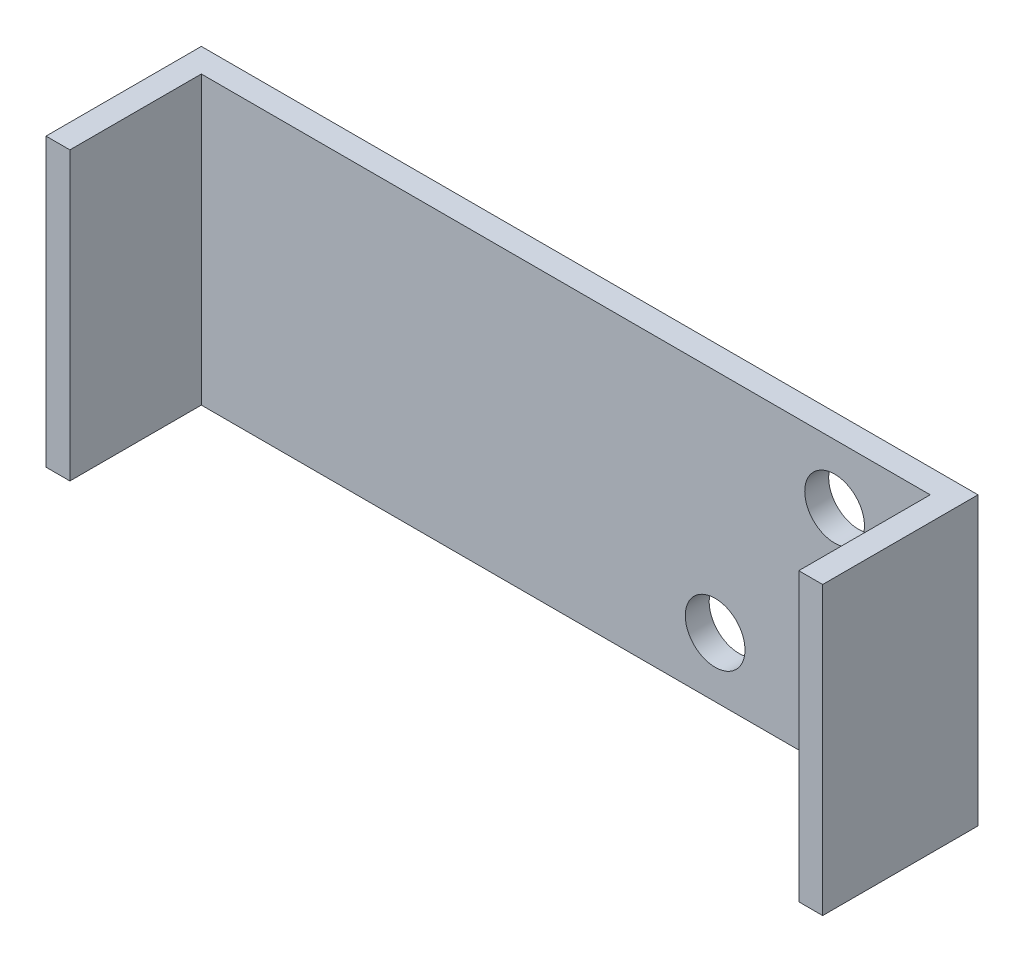
ISO-10303-21;
HEADER;
FILE_DESCRIPTION(('STEP AP214'),'2;1');
FILE_NAME('part.step','',(''),(''),'','','');
FILE_SCHEMA(('AUTOMOTIVE_DESIGN { 1 0 10303 214 1 1 1 1 }'));
ENDSEC;
DATA;
#1=APPLICATION_CONTEXT('core data for automotive mechanical design processes');
#2=APPLICATION_PROTOCOL_DEFINITION('international standard','automotive_design',2000,#1);
#3=PRODUCT_CONTEXT('',#1,'mechanical');
#4=PRODUCT('Part','Part','',(#3));
#5=PRODUCT_RELATED_PRODUCT_CATEGORY('part','',(#4));
#6=PRODUCT_DEFINITION_FORMATION('','',#4);
#7=PRODUCT_DEFINITION_CONTEXT('part definition',#1,'design');
#8=PRODUCT_DEFINITION('design','',#6,#7);
#9=PRODUCT_DEFINITION_SHAPE('','',#8);
#10=(LENGTH_UNIT() NAMED_UNIT(*) SI_UNIT(.MILLI.,.METRE.));
#11=(NAMED_UNIT(*) PLANE_ANGLE_UNIT() SI_UNIT($,.RADIAN.));
#12=(NAMED_UNIT(*) SI_UNIT($,.STERADIAN.) SOLID_ANGLE_UNIT());
#13=UNCERTAINTY_MEASURE_WITH_UNIT(LENGTH_MEASURE(1.E-05),#10,'distance_accuracy_value','');
#14=(GEOMETRIC_REPRESENTATION_CONTEXT(3) GLOBAL_UNCERTAINTY_ASSIGNED_CONTEXT((#13)) GLOBAL_UNIT_ASSIGNED_CONTEXT((#10,
#11,#12)) REPRESENTATION_CONTEXT('',''));
#15=CARTESIAN_POINT('',(0.,0.,0.));
#16=DIRECTION('',(0.,0.,1.));
#17=DIRECTION('',(1.,0.,0.));
#18=AXIS2_PLACEMENT_3D('',#15,#16,#17);
#19=CARTESIAN_POINT('',(0.,0.,13.));
#20=DIRECTION('',(0.,0.,1.));
#21=DIRECTION('',(1.,0.,0.));
#22=AXIS2_PLACEMENT_3D('',#19,#20,#21);
#23=PLANE('',#22);
#24=DIRECTION('',(0.,-1.,0.));
#25=VECTOR('',#24,1.);
#26=CARTESIAN_POINT('',(-63.,24.,13.));
#27=LINE('',#26,#25);
#28=CARTESIAN_POINT('',(-63.,24.,13.));
#29=VERTEX_POINT('',#28);
#30=CARTESIAN_POINT('',(-63.,0.,13.));
#31=VERTEX_POINT('',#30);
#32=EDGE_CURVE('E113',#29,#31,#27,.T.);
#33=ORIENTED_EDGE('',*,*,#32,.F.);
#34=DIRECTION('',(-1.,0.,0.));
#35=VECTOR('',#34,1.);
#36=CARTESIAN_POINT('',(0.,24.,13.));
#37=LINE('',#36,#35);
#38=CARTESIAN_POINT('',(-65.,24.,13.));
#39=VERTEX_POINT('',#38);
#40=EDGE_CURVE('E146',#29,#39,#37,.T.);
#41=ORIENTED_EDGE('',*,*,#40,.T.);
#42=DIRECTION('',(0.,-1.,0.));
#43=VECTOR('',#42,1.);
#44=CARTESIAN_POINT('',(-65.,0.,13.));
#45=LINE('',#44,#43);
#46=CARTESIAN_POINT('',(-65.,0.,13.));
#47=VERTEX_POINT('',#46);
#48=EDGE_CURVE('E148',#39,#47,#45,.T.);
#49=ORIENTED_EDGE('',*,*,#48,.T.);
#50=DIRECTION('',(1.,0.,0.));
#51=VECTOR('',#50,1.);
#52=CARTESIAN_POINT('',(0.,0.,13.));
#53=LINE('',#52,#51);
#54=EDGE_CURVE('E150',#47,#31,#53,.T.);
#55=ORIENTED_EDGE('',*,*,#54,.T.);
#56=EDGE_LOOP('',(#33,#41,#49,#55));
#57=FACE_BOUND('',#56,.T.);
#58=ADVANCED_FACE('F33',(#57),#23,.T.);
#59=CARTESIAN_POINT('',(0.,0.,13.));
#60=DIRECTION('',(-1.,0.,0.));
#61=DIRECTION('',(0.,-1.,0.));
#62=AXIS2_PLACEMENT_3D('',#59,#60,#61);
#63=PLANE('',#62);
#64=DIRECTION('',(0.,1.,0.));
#65=VECTOR('',#64,1.);
#66=CARTESIAN_POINT('',(0.,0.,0.));
#67=LINE('',#66,#65);
#68=CARTESIAN_POINT('',(0.,0.,0.));
#69=VERTEX_POINT('',#68);
#70=CARTESIAN_POINT('',(0.,24.,0.));
#71=VERTEX_POINT('',#70);
#72=EDGE_CURVE('E140',#69,#71,#67,.T.);
#73=ORIENTED_EDGE('',*,*,#72,.T.);
#74=DIRECTION('',(0.,0.,-1.));
#75=VECTOR('',#74,1.);
#76=CARTESIAN_POINT('',(0.,24.,13.));
#77=LINE('',#76,#75);
#78=CARTESIAN_POINT('',(0.,24.,13.));
#79=VERTEX_POINT('',#78);
#80=EDGE_CURVE('E11',#79,#71,#77,.T.);
#81=ORIENTED_EDGE('',*,*,#80,.F.);
#82=DIRECTION('',(0.,1.,0.));
#83=VECTOR('',#82,1.);
#84=CARTESIAN_POINT('',(0.,0.,13.));
#85=LINE('',#84,#83);
#86=CARTESIAN_POINT('',(0.,0.,13.));
#87=VERTEX_POINT('',#86);
#88=EDGE_CURVE('E144',#87,#79,#85,.T.);
#89=ORIENTED_EDGE('',*,*,#88,.F.);
#90=DIRECTION('',(0.,0.,-1.));
#91=VECTOR('',#90,1.);
#92=CARTESIAN_POINT('',(0.,0.,13.));
#93=LINE('',#92,#91);
#94=EDGE_CURVE('E152',#87,#69,#93,.T.);
#95=ORIENTED_EDGE('',*,*,#94,.T.);
#96=EDGE_LOOP('',(#73,#81,#89,#95));
#97=FACE_BOUND('',#96,.T.);
#98=ADVANCED_FACE('F35',(#97),#63,.F.);
#99=CARTESIAN_POINT('',(0.,24.,13.));
#100=DIRECTION('',(0.,-1.,0.));
#101=DIRECTION('',(1.,0.,0.));
#102=AXIS2_PLACEMENT_3D('',#99,#100,#101);
#103=PLANE('',#102);
#104=ORIENTED_EDGE('',*,*,#40,.F.);
#105=DIRECTION('',(0.,0.,1.));
#106=VECTOR('',#105,1.);
#107=CARTESIAN_POINT('',(-63.,24.,2.));
#108=LINE('',#107,#106);
#109=CARTESIAN_POINT('',(-63.,24.,2.));
#110=VERTEX_POINT('',#109);
#111=EDGE_CURVE('E138',#110,#29,#108,.T.);
#112=ORIENTED_EDGE('',*,*,#111,.F.);
#113=DIRECTION('',(-1.,0.,0.));
#114=VECTOR('',#113,1.);
#115=CARTESIAN_POINT('',(-63.,24.,2.));
#116=LINE('',#115,#114);
#117=CARTESIAN_POINT('',(-2.,24.,2.));
#118=VERTEX_POINT('',#117);
#119=EDGE_CURVE('E117',#118,#110,#116,.T.);
#120=ORIENTED_EDGE('',*,*,#119,.F.);
#121=DIRECTION('',(0.,0.,1.));
#122=VECTOR('',#121,1.);
#123=CARTESIAN_POINT('',(-2.,24.,2.));
#124=LINE('',#123,#122);
#125=CARTESIAN_POINT('',(-2.,24.,13.));
#126=VERTEX_POINT('',#125);
#127=EDGE_CURVE('E141',#118,#126,#124,.T.);
#128=ORIENTED_EDGE('',*,*,#127,.T.);
#129=EDGE_CURVE('E85',#79,#126,#37,.T.);
#130=ORIENTED_EDGE('',*,*,#129,.F.);
#131=ORIENTED_EDGE('',*,*,#80,.T.);
#132=DIRECTION('',(-1.,0.,0.));
#133=VECTOR('',#132,1.);
#134=CARTESIAN_POINT('',(0.,24.,0.));
#135=LINE('',#134,#133);
#136=CARTESIAN_POINT('',(-65.,24.,0.));
#137=VERTEX_POINT('',#136);
#138=EDGE_CURVE('E155',#71,#137,#135,.T.);
#139=ORIENTED_EDGE('',*,*,#138,.T.);
#140=DIRECTION('',(0.,0.,-1.));
#141=VECTOR('',#140,1.);
#142=CARTESIAN_POINT('',(-65.,24.,13.));
#143=LINE('',#142,#141);
#144=EDGE_CURVE('E41',#39,#137,#143,.T.);
#145=ORIENTED_EDGE('',*,*,#144,.F.);
#146=EDGE_LOOP('',(#104,#112,#120,#128,#130,#131,#139,#145));
#147=FACE_BOUND('',#146,.T.);
#148=ADVANCED_FACE('F178',(#147),#103,.F.);
#149=CARTESIAN_POINT('',(-65.,0.,13.));
#150=DIRECTION('',(1.,0.,0.));
#151=DIRECTION('',(0.,0.,-1.));
#152=AXIS2_PLACEMENT_3D('',#149,#150,#151);
#153=PLANE('',#152);
#154=DIRECTION('',(0.,-1.,0.));
#155=VECTOR('',#154,1.);
#156=CARTESIAN_POINT('',(-65.,0.,0.));
#157=LINE('',#156,#155);
#158=CARTESIAN_POINT('',(-65.,0.,0.));
#159=VERTEX_POINT('',#158);
#160=EDGE_CURVE('E157',#137,#159,#157,.T.);
#161=ORIENTED_EDGE('',*,*,#160,.T.);
#162=DIRECTION('',(0.,0.,-1.));
#163=VECTOR('',#162,1.);
#164=CARTESIAN_POINT('',(-65.,0.,13.));
#165=LINE('',#164,#163);
#166=EDGE_CURVE('E161',#47,#159,#165,.T.);
#167=ORIENTED_EDGE('',*,*,#166,.F.);
#168=ORIENTED_EDGE('',*,*,#48,.F.);
#169=ORIENTED_EDGE('',*,*,#144,.T.);
#170=EDGE_LOOP('',(#161,#167,#168,#169));
#171=FACE_BOUND('',#170,.T.);
#172=ADVANCED_FACE('F167',(#171),#153,.F.);
#173=CARTESIAN_POINT('',(0.,0.,13.));
#174=DIRECTION('',(0.,1.,0.));
#175=DIRECTION('',(0.,0.,1.));
#176=AXIS2_PLACEMENT_3D('',#173,#174,#175);
#177=PLANE('',#176);
#178=DIRECTION('',(1.,0.,0.));
#179=VECTOR('',#178,1.);
#180=CARTESIAN_POINT('',(-63.,0.,2.));
#181=LINE('',#180,#179);
#182=CARTESIAN_POINT('',(-63.,0.,2.));
#183=VERTEX_POINT('',#182);
#184=CARTESIAN_POINT('',(-2.,0.,2.));
#185=VERTEX_POINT('',#184);
#186=EDGE_CURVE('E123',#183,#185,#181,.T.);
#187=ORIENTED_EDGE('',*,*,#186,.F.);
#188=DIRECTION('',(0.,0.,1.));
#189=VECTOR('',#188,1.);
#190=CARTESIAN_POINT('',(-63.,0.,2.));
#191=LINE('',#190,#189);
#192=EDGE_CURVE('E107',#183,#31,#191,.T.);
#193=ORIENTED_EDGE('',*,*,#192,.T.);
#194=ORIENTED_EDGE('',*,*,#54,.F.);
#195=ORIENTED_EDGE('',*,*,#166,.T.);
#196=DIRECTION('',(1.,0.,0.));
#197=VECTOR('',#196,1.);
#198=CARTESIAN_POINT('',(0.,0.,0.));
#199=LINE('',#198,#197);
#200=EDGE_CURVE('E78',#159,#69,#199,.T.);
#201=ORIENTED_EDGE('',*,*,#200,.T.);
#202=ORIENTED_EDGE('',*,*,#94,.F.);
#203=CARTESIAN_POINT('',(-2.,0.,13.));
#204=VERTEX_POINT('',#203);
#205=EDGE_CURVE('E56',#204,#87,#53,.T.);
#206=ORIENTED_EDGE('',*,*,#205,.F.);
#207=DIRECTION('',(0.,0.,1.));
#208=VECTOR('',#207,1.);
#209=CARTESIAN_POINT('',(-2.,0.,2.));
#210=LINE('',#209,#208);
#211=EDGE_CURVE('E48',#185,#204,#210,.T.);
#212=ORIENTED_EDGE('',*,*,#211,.F.);
#213=EDGE_LOOP('',(#187,#193,#194,#195,#201,#202,#206,#212));
#214=FACE_BOUND('',#213,.T.);
#215=ADVANCED_FACE('F128',(#214),#177,.F.);
#216=DIRECTION('',(0.,1.,0.));
#217=VECTOR('',#216,1.);
#218=CARTESIAN_POINT('',(-2.,24.,13.));
#219=LINE('',#218,#217);
#220=EDGE_CURVE('E126',#204,#126,#219,.T.);
#221=ORIENTED_EDGE('',*,*,#220,.F.);
#222=ORIENTED_EDGE('',*,*,#205,.T.);
#223=ORIENTED_EDGE('',*,*,#88,.T.);
#224=ORIENTED_EDGE('',*,*,#129,.T.);
#225=EDGE_LOOP('',(#221,#222,#223,#224));
#226=FACE_BOUND('',#225,.T.);
#227=ADVANCED_FACE('F176',(#226),#23,.T.);
#228=CARTESIAN_POINT('',(0.,0.,0.));
#229=DIRECTION('',(0.,0.,1.));
#230=DIRECTION('',(1.,0.,0.));
#231=AXIS2_PLACEMENT_3D('',#228,#229,#230);
#232=PLANE('',#231);
#233=CARTESIAN_POINT('',(-10.,19.,0.));
#234=DIRECTION('',(0.,0.,-1.));
#235=DIRECTION('',(-1.,0.,0.));
#236=AXIS2_PLACEMENT_3D('',#233,#234,#235);
#237=CIRCLE('',#236,2.5);
#238=CARTESIAN_POINT('',(-12.5,19.,0.));
#239=VERTEX_POINT('',#238);
#240=EDGE_CURVE('E274',#239,#239,#237,.T.);
#241=ORIENTED_EDGE('',*,*,#240,.F.);
#242=EDGE_LOOP('',(#241));
#243=FACE_BOUND('',#242,.T.);
#244=CARTESIAN_POINT('',(-20.,5.00000000000001,0.));
#245=DIRECTION('',(0.,0.,-1.));
#246=DIRECTION('',(-1.,0.,0.));
#247=AXIS2_PLACEMENT_3D('',#244,#245,#246);
#248=CIRCLE('',#247,2.5);
#249=CARTESIAN_POINT('',(-22.5,5.00000000000001,0.));
#250=VERTEX_POINT('',#249);
#251=EDGE_CURVE('E279',#250,#250,#248,.T.);
#252=ORIENTED_EDGE('',*,*,#251,.F.);
#253=EDGE_LOOP('',(#252));
#254=FACE_BOUND('',#253,.T.);
#255=ORIENTED_EDGE('',*,*,#72,.F.);
#256=ORIENTED_EDGE('',*,*,#200,.F.);
#257=ORIENTED_EDGE('',*,*,#160,.F.);
#258=ORIENTED_EDGE('',*,*,#138,.F.);
#259=EDGE_LOOP('',(#255,#256,#257,#258));
#260=FACE_BOUND('',#259,.T.);
#261=ADVANCED_FACE('F172',(#243,#254,#260),#232,.F.);
#262=CARTESIAN_POINT('',(-63.,24.,2.));
#263=DIRECTION('',(-1.,0.,0.));
#264=DIRECTION('',(0.,0.,1.));
#265=AXIS2_PLACEMENT_3D('',#262,#263,#264);
#266=PLANE('',#265);
#267=ORIENTED_EDGE('',*,*,#32,.T.);
#268=ORIENTED_EDGE('',*,*,#192,.F.);
#269=DIRECTION('',(0.,-1.,0.));
#270=VECTOR('',#269,1.);
#271=CARTESIAN_POINT('',(-63.,24.,2.));
#272=LINE('',#271,#270);
#273=EDGE_CURVE('E110',#110,#183,#272,.T.);
#274=ORIENTED_EDGE('',*,*,#273,.F.);
#275=ORIENTED_EDGE('',*,*,#111,.T.);
#276=EDGE_LOOP('',(#267,#268,#274,#275));
#277=FACE_BOUND('',#276,.T.);
#278=ADVANCED_FACE('F109',(#277),#266,.F.);
#279=CARTESIAN_POINT('',(-2.,24.,2.));
#280=DIRECTION('',(1.,0.,0.));
#281=DIRECTION('',(0.,0.,-1.));
#282=AXIS2_PLACEMENT_3D('',#279,#280,#281);
#283=PLANE('',#282);
#284=ORIENTED_EDGE('',*,*,#220,.T.);
#285=ORIENTED_EDGE('',*,*,#127,.F.);
#286=DIRECTION('',(0.,1.,0.));
#287=VECTOR('',#286,1.);
#288=CARTESIAN_POINT('',(-2.,24.,2.));
#289=LINE('',#288,#287);
#290=EDGE_CURVE('E129',#185,#118,#289,.T.);
#291=ORIENTED_EDGE('',*,*,#290,.F.);
#292=ORIENTED_EDGE('',*,*,#211,.T.);
#293=EDGE_LOOP('',(#284,#285,#291,#292));
#294=FACE_BOUND('',#293,.T.);
#295=ADVANCED_FACE('F177',(#294),#283,.F.);
#296=CARTESIAN_POINT('',(0.,0.,2.));
#297=DIRECTION('',(0.,0.,1.));
#298=DIRECTION('',(1.,0.,0.));
#299=AXIS2_PLACEMENT_3D('',#296,#297,#298);
#300=PLANE('',#299);
#301=CARTESIAN_POINT('',(-10.,19.,2.));
#302=DIRECTION('',(0.,0.,-1.));
#303=DIRECTION('',(-1.,0.,0.));
#304=AXIS2_PLACEMENT_3D('',#301,#302,#303);
#305=CIRCLE('',#304,2.5);
#306=CARTESIAN_POINT('',(-12.5,19.,2.));
#307=VERTEX_POINT('',#306);
#308=EDGE_CURVE('E136',#307,#307,#305,.T.);
#309=ORIENTED_EDGE('',*,*,#308,.T.);
#310=EDGE_LOOP('',(#309));
#311=FACE_BOUND('',#310,.T.);
#312=CARTESIAN_POINT('',(-20.,5.00000000000001,2.));
#313=DIRECTION('',(0.,0.,-1.));
#314=DIRECTION('',(-1.,0.,0.));
#315=AXIS2_PLACEMENT_3D('',#312,#313,#314);
#316=CIRCLE('',#315,2.5);
#317=CARTESIAN_POINT('',(-22.5,5.00000000000001,2.));
#318=VERTEX_POINT('',#317);
#319=EDGE_CURVE('E275',#318,#318,#316,.T.);
#320=ORIENTED_EDGE('',*,*,#319,.T.);
#321=EDGE_LOOP('',(#320));
#322=FACE_BOUND('',#321,.T.);
#323=ORIENTED_EDGE('',*,*,#273,.T.);
#324=ORIENTED_EDGE('',*,*,#186,.T.);
#325=ORIENTED_EDGE('',*,*,#290,.T.);
#326=ORIENTED_EDGE('',*,*,#119,.T.);
#327=EDGE_LOOP('',(#323,#324,#325,#326));
#328=FACE_BOUND('',#327,.T.);
#329=ADVANCED_FACE('F121',(#311,#322,#328),#300,.T.);
#330=CARTESIAN_POINT('',(-20.,5.00000000000001,2.));
#331=DIRECTION('',(0.,0.,-1.));
#332=DIRECTION('',(-1.,0.,0.));
#333=AXIS2_PLACEMENT_3D('',#330,#331,#332);
#334=CYLINDRICAL_SURFACE('',#333,2.5);
#335=ORIENTED_EDGE('',*,*,#319,.F.);
#336=EDGE_LOOP('',(#335));
#337=FACE_BOUND('',#336,.T.);
#338=ORIENTED_EDGE('',*,*,#251,.T.);
#339=EDGE_LOOP('',(#338));
#340=FACE_BOUND('',#339,.T.);
#341=ADVANCED_FACE('F242',(#337,#340),#334,.F.);
#342=CARTESIAN_POINT('',(-10.,19.,2.));
#343=DIRECTION('',(0.,0.,-1.));
#344=DIRECTION('',(-1.,0.,0.));
#345=AXIS2_PLACEMENT_3D('',#342,#343,#344);
#346=CYLINDRICAL_SURFACE('',#345,2.5);
#347=ORIENTED_EDGE('',*,*,#308,.F.);
#348=EDGE_LOOP('',(#347));
#349=FACE_BOUND('',#348,.T.);
#350=ORIENTED_EDGE('',*,*,#240,.T.);
#351=EDGE_LOOP('',(#350));
#352=FACE_BOUND('',#351,.T.);
#353=ADVANCED_FACE('F251',(#349,#352),#346,.F.);
#354=CLOSED_SHELL('',(#58,#98,#148,#172,#215,#227,#261,#278,#295,#329,#341,#353));
#355=MANIFOLD_SOLID_BREP('B2',#354);
#356=ADVANCED_BREP_SHAPE_REPRESENTATION('',(#18,#355),#14);
#357=SHAPE_DEFINITION_REPRESENTATION(#9,#356);
ENDSEC;
END-ISO-10303-21;
